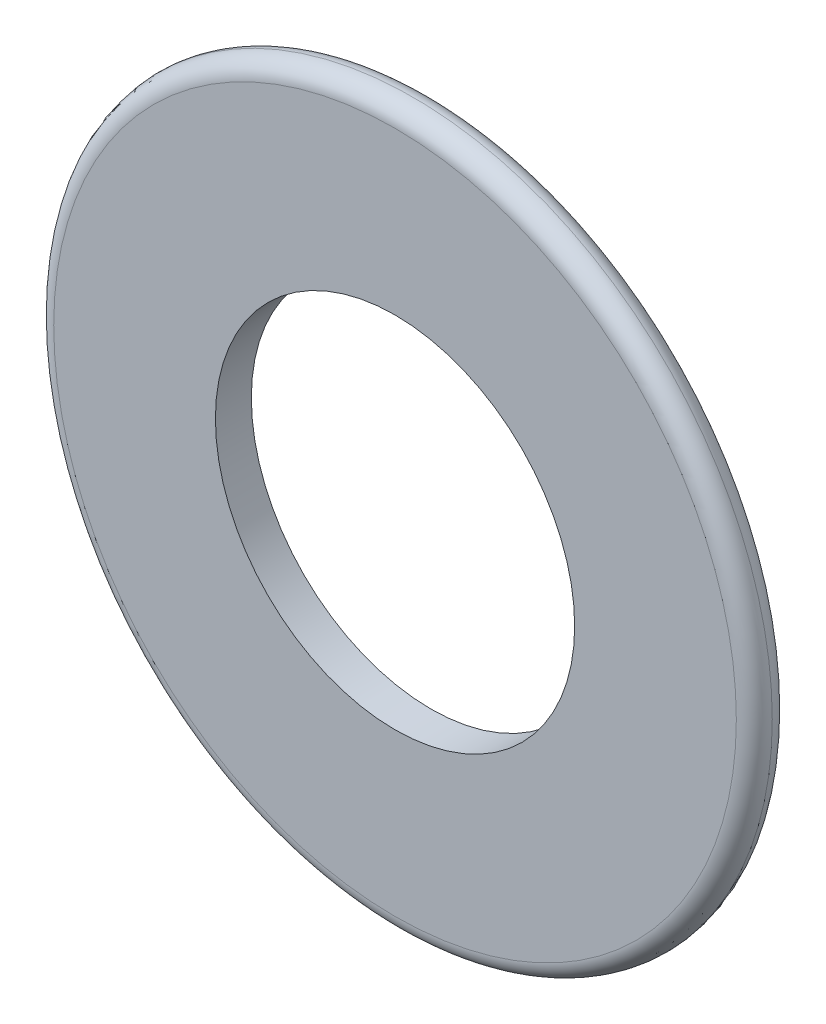
ISO-10303-21;
HEADER;
FILE_DESCRIPTION(('STEP AP214'),'2;1');
FILE_NAME('part.step','',(''),(''),'','','');
FILE_SCHEMA(('AUTOMOTIVE_DESIGN { 1 0 10303 214 1 1 1 1 }'));
ENDSEC;
DATA;
#1=APPLICATION_CONTEXT('core data for automotive mechanical design processes');
#2=APPLICATION_PROTOCOL_DEFINITION('international standard','automotive_design',2000,#1);
#3=PRODUCT_CONTEXT('',#1,'mechanical');
#4=PRODUCT('Part','Part','',(#3));
#5=PRODUCT_RELATED_PRODUCT_CATEGORY('part','',(#4));
#6=PRODUCT_DEFINITION_FORMATION('','',#4);
#7=PRODUCT_DEFINITION_CONTEXT('part definition',#1,'design');
#8=PRODUCT_DEFINITION('design','',#6,#7);
#9=PRODUCT_DEFINITION_SHAPE('','',#8);
#10=(LENGTH_UNIT() NAMED_UNIT(*) SI_UNIT(.MILLI.,.METRE.));
#11=(NAMED_UNIT(*) PLANE_ANGLE_UNIT() SI_UNIT($,.RADIAN.));
#12=(NAMED_UNIT(*) SI_UNIT($,.STERADIAN.) SOLID_ANGLE_UNIT());
#13=UNCERTAINTY_MEASURE_WITH_UNIT(LENGTH_MEASURE(1.E-05),#10,'distance_accuracy_value','');
#14=(GEOMETRIC_REPRESENTATION_CONTEXT(3) GLOBAL_UNCERTAINTY_ASSIGNED_CONTEXT((#13)) GLOBAL_UNIT_ASSIGNED_CONTEXT((#10,
#11,#12)) REPRESENTATION_CONTEXT('',''));
#15=CARTESIAN_POINT('',(0.,0.,0.));
#16=DIRECTION('',(0.,0.,1.));
#17=DIRECTION('',(1.,0.,0.));
#18=AXIS2_PLACEMENT_3D('',#15,#16,#17);
#19=CARTESIAN_POINT('',(0.,0.,1.));
#20=DIRECTION('',(0.,0.,1.));
#21=DIRECTION('',(1.,0.,0.));
#22=AXIS2_PLACEMENT_3D('',#19,#20,#21);
#23=PLANE('',#22);
#24=CARTESIAN_POINT('',(0.,0.,1.));
#25=DIRECTION('',(0.,0.,1.));
#26=DIRECTION('',(1.,0.,0.));
#27=AXIS2_PLACEMENT_3D('',#24,#25,#26);
#28=CIRCLE('',#27,9.5);
#29=CARTESIAN_POINT('',(9.5,0.,1.));
#30=VERTEX_POINT('',#29);
#31=EDGE_CURVE('E10',#30,#30,#28,.T.);
#32=ORIENTED_EDGE('',*,*,#31,.T.);
#33=EDGE_LOOP('',(#32));
#34=FACE_BOUND('',#33,.T.);
#35=CARTESIAN_POINT('',(0.,0.,1.));
#36=DIRECTION('',(0.,0.,1.));
#37=DIRECTION('',(1.,0.,0.));
#38=AXIS2_PLACEMENT_3D('',#35,#36,#37);
#39=CIRCLE('',#38,5.);
#40=CARTESIAN_POINT('',(5.,0.,1.));
#41=VERTEX_POINT('',#40);
#42=EDGE_CURVE('E51',#41,#41,#39,.T.);
#43=ORIENTED_EDGE('',*,*,#42,.F.);
#44=EDGE_LOOP('',(#43));
#45=FACE_BOUND('',#44,.T.);
#46=ADVANCED_FACE('F37',(#34,#45),#23,.T.);
#47=CARTESIAN_POINT('',(0.,0.,0.));
#48=DIRECTION('',(0.,0.,1.));
#49=DIRECTION('',(1.,0.,0.));
#50=AXIS2_PLACEMENT_3D('',#47,#48,#49);
#51=PLANE('',#50);
#52=CARTESIAN_POINT('',(0.,0.,0.));
#53=DIRECTION('',(0.,0.,1.));
#54=DIRECTION('',(1.,0.,0.));
#55=AXIS2_PLACEMENT_3D('',#52,#53,#54);
#56=CIRCLE('',#55,9.5);
#57=CARTESIAN_POINT('',(9.5,0.,0.));
#58=VERTEX_POINT('',#57);
#59=EDGE_CURVE('E46',#58,#58,#56,.F.);
#60=ORIENTED_EDGE('',*,*,#59,.T.);
#61=EDGE_LOOP('',(#60));
#62=FACE_BOUND('',#61,.T.);
#63=CARTESIAN_POINT('',(0.,0.,0.));
#64=DIRECTION('',(0.,0.,1.));
#65=DIRECTION('',(1.,0.,0.));
#66=AXIS2_PLACEMENT_3D('',#63,#64,#65);
#67=CIRCLE('',#66,5.);
#68=CARTESIAN_POINT('',(5.,0.,0.));
#69=VERTEX_POINT('',#68);
#70=EDGE_CURVE('E54',#69,#69,#67,.T.);
#71=ORIENTED_EDGE('',*,*,#70,.T.);
#72=EDGE_LOOP('',(#71));
#73=FACE_BOUND('',#72,.T.);
#74=ADVANCED_FACE('F66',(#62,#73),#51,.F.);
#75=CARTESIAN_POINT('',(0.,0.,1.));
#76=DIRECTION('',(0.,0.,-1.));
#77=DIRECTION('',(-1.,0.,0.));
#78=AXIS2_PLACEMENT_3D('',#75,#76,#77);
#79=CYLINDRICAL_SURFACE('',#78,5.);
#80=ORIENTED_EDGE('',*,*,#42,.T.);
#81=EDGE_LOOP('',(#80));
#82=FACE_BOUND('',#81,.T.);
#83=ORIENTED_EDGE('',*,*,#70,.F.);
#84=EDGE_LOOP('',(#83));
#85=FACE_BOUND('',#84,.T.);
#86=ADVANCED_FACE('F62',(#82,#85),#79,.F.);
#87=CARTESIAN_POINT('',(0.,0.,0.5));
#88=DIRECTION('',(0.,0.,1.));
#89=DIRECTION('',(1.,0.,0.));
#90=AXIS2_PLACEMENT_3D('',#87,#88,#89);
#91=TOROIDAL_SURFACE('',#90,9.5,0.5);
#92=ORIENTED_EDGE('',*,*,#31,.F.);
#93=EDGE_LOOP('',(#92));
#94=FACE_BOUND('',#93,.T.);
#95=CARTESIAN_POINT('',(0.,0.,0.5));
#96=DIRECTION('',(0.,0.,1.));
#97=DIRECTION('',(1.,0.,0.));
#98=AXIS2_PLACEMENT_3D('',#95,#96,#97);
#99=CIRCLE('',#98,10.);
#100=CARTESIAN_POINT('',(10.,0.,0.5));
#101=VERTEX_POINT('',#100);
#102=EDGE_CURVE('E41',#101,#101,#99,.F.);
#103=ORIENTED_EDGE('',*,*,#102,.F.);
#104=EDGE_LOOP('',(#103));
#105=FACE_BOUND('',#104,.T.);
#106=ADVANCED_FACE('F39',(#94,#105),#91,.T.);
#107=CARTESIAN_POINT('',(0.,0.,0.5));
#108=DIRECTION('',(0.,0.,1.));
#109=DIRECTION('',(1.,0.,0.));
#110=AXIS2_PLACEMENT_3D('',#107,#108,#109);
#111=TOROIDAL_SURFACE('',#110,9.5,0.5);
#112=ORIENTED_EDGE('',*,*,#59,.F.);
#113=EDGE_LOOP('',(#112));
#114=FACE_BOUND('',#113,.T.);
#115=ORIENTED_EDGE('',*,*,#102,.T.);
#116=EDGE_LOOP('',(#115));
#117=FACE_BOUND('',#116,.T.);
#118=ADVANCED_FACE('F74',(#114,#117),#111,.T.);
#119=CLOSED_SHELL('',(#46,#74,#86,#106,#118));
#120=MANIFOLD_SOLID_BREP('B2',#119);
#121=ADVANCED_BREP_SHAPE_REPRESENTATION('',(#18,#120),#14);
#122=SHAPE_DEFINITION_REPRESENTATION(#9,#121);
ENDSEC;
END-ISO-10303-21;
